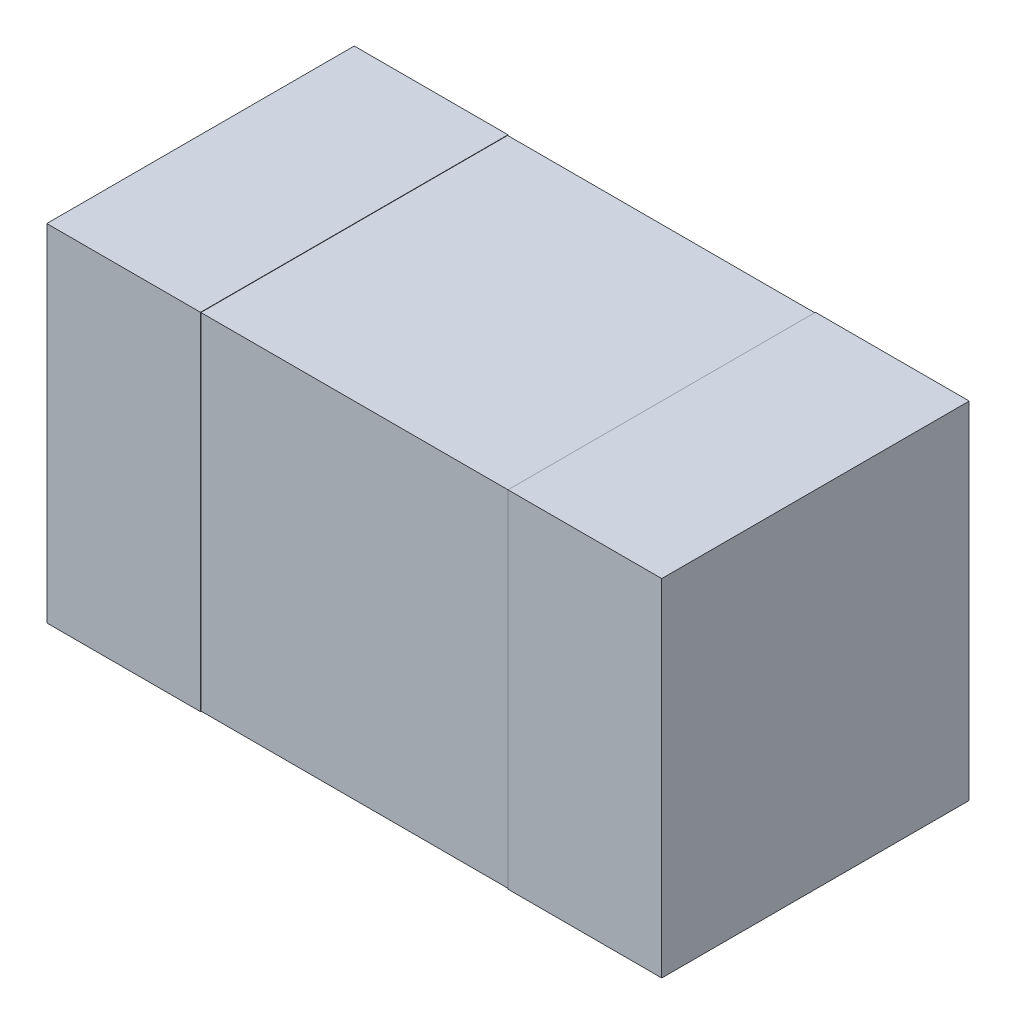
ISO-10303-21;
HEADER;
FILE_DESCRIPTION(('STEP AP214'),'2;1');
FILE_NAME('part.step','',(''),(''),'','','');
FILE_SCHEMA(('AUTOMOTIVE_DESIGN { 1 0 10303 214 1 1 1 1 }'));
ENDSEC;
DATA;
#1=APPLICATION_CONTEXT('core data for automotive mechanical design processes');
#2=APPLICATION_PROTOCOL_DEFINITION('international standard','automotive_design',2000,#1);
#3=PRODUCT_CONTEXT('',#1,'mechanical');
#4=PRODUCT('Part','Part','',(#3));
#5=PRODUCT_RELATED_PRODUCT_CATEGORY('part','',(#4));
#6=PRODUCT_DEFINITION_FORMATION('','',#4);
#7=PRODUCT_DEFINITION_CONTEXT('part definition',#1,'design');
#8=PRODUCT_DEFINITION('design','',#6,#7);
#9=PRODUCT_DEFINITION_SHAPE('','',#8);
#10=(LENGTH_UNIT() NAMED_UNIT(*) SI_UNIT(.MILLI.,.METRE.));
#11=(NAMED_UNIT(*) PLANE_ANGLE_UNIT() SI_UNIT($,.RADIAN.));
#12=(NAMED_UNIT(*) SI_UNIT($,.STERADIAN.) SOLID_ANGLE_UNIT());
#13=UNCERTAINTY_MEASURE_WITH_UNIT(LENGTH_MEASURE(1.E-05),#10,'distance_accuracy_value','');
#14=(GEOMETRIC_REPRESENTATION_CONTEXT(3) GLOBAL_UNCERTAINTY_ASSIGNED_CONTEXT((#13)) GLOBAL_UNIT_ASSIGNED_CONTEXT((#10,
#11,#12)) REPRESENTATION_CONTEXT('',''));
#15=CARTESIAN_POINT('',(0.,0.,0.));
#16=DIRECTION('',(0.,0.,1.));
#17=DIRECTION('',(1.,0.,0.));
#18=AXIS2_PLACEMENT_3D('',#15,#16,#17);
#19=CARTESIAN_POINT('',(-0.8,0.45,0.8));
#20=DIRECTION('',(1.,0.,0.));
#21=DIRECTION('',(0.,0.,-1.));
#22=AXIS2_PLACEMENT_3D('',#19,#20,#21);
#23=PLANE('',#22);
#24=DIRECTION('',(0.,1.,0.));
#25=VECTOR('',#24,1.);
#26=CARTESIAN_POINT('',(-0.8,0.45,0.));
#27=LINE('',#26,#25);
#28=CARTESIAN_POINT('',(-0.8,0.45,0.));
#29=VERTEX_POINT('',#28);
#30=CARTESIAN_POINT('',(-0.8,-0.45,0.));
#31=VERTEX_POINT('',#30);
#32=EDGE_CURVE('E122',#29,#31,#27,.F.);
#33=ORIENTED_EDGE('',*,*,#32,.T.);
#34=DIRECTION('',(0.,0.,1.));
#35=VECTOR('',#34,1.);
#36=CARTESIAN_POINT('',(-0.8,-0.45,0.4));
#37=LINE('',#36,#35);
#38=CARTESIAN_POINT('',(-0.8,-0.45,0.8));
#39=VERTEX_POINT('',#38);
#40=EDGE_CURVE('E114',#31,#39,#37,.T.);
#41=ORIENTED_EDGE('',*,*,#40,.T.);
#42=DIRECTION('',(0.,1.,0.));
#43=VECTOR('',#42,1.);
#44=CARTESIAN_POINT('',(-0.8,0.45,0.8));
#45=LINE('',#44,#43);
#46=CARTESIAN_POINT('',(-0.8,0.45,0.8));
#47=VERTEX_POINT('',#46);
#48=EDGE_CURVE('E20',#39,#47,#45,.T.);
#49=ORIENTED_EDGE('',*,*,#48,.T.);
#50=DIRECTION('',(0.,0.,1.));
#51=VECTOR('',#50,1.);
#52=CARTESIAN_POINT('',(-0.8,0.45,0.4));
#53=LINE('',#52,#51);
#54=EDGE_CURVE('E102',#29,#47,#53,.T.);
#55=ORIENTED_EDGE('',*,*,#54,.F.);
#56=EDGE_LOOP('',(#33,#41,#49,#55));
#57=FACE_BOUND('',#56,.T.);
#58=ADVANCED_FACE('F17',(#57),#23,.F.);
#59=CARTESIAN_POINT('',(0.8,0.45,0.8));
#60=DIRECTION('',(0.,0.,-1.));
#61=DIRECTION('',(-1.,0.,0.));
#62=AXIS2_PLACEMENT_3D('',#59,#60,#61);
#63=PLANE('',#62);
#64=ORIENTED_EDGE('',*,*,#48,.F.);
#65=DIRECTION('',(1.,0.,0.));
#66=VECTOR('',#65,1.);
#67=CARTESIAN_POINT('',(0.,-0.45,0.8));
#68=LINE('',#67,#66);
#69=CARTESIAN_POINT('',(-0.4,-0.45,0.8));
#70=VERTEX_POINT('',#69);
#71=EDGE_CURVE('E130',#39,#70,#68,.T.);
#72=ORIENTED_EDGE('',*,*,#71,.T.);
#73=DIRECTION('',(0.,1.,0.));
#74=VECTOR('',#73,1.);
#75=CARTESIAN_POINT('',(-0.4,0.45,0.8));
#76=LINE('',#75,#74);
#77=CARTESIAN_POINT('',(-0.4,0.45,0.8));
#78=VERTEX_POINT('',#77);
#79=EDGE_CURVE('E120',#70,#78,#76,.T.);
#80=ORIENTED_EDGE('',*,*,#79,.T.);
#81=DIRECTION('',(1.,0.,0.));
#82=VECTOR('',#81,1.);
#83=CARTESIAN_POINT('',(0.,0.45,0.8));
#84=LINE('',#83,#82);
#85=EDGE_CURVE('E109',#47,#78,#84,.T.);
#86=ORIENTED_EDGE('',*,*,#85,.F.);
#87=EDGE_LOOP('',(#64,#72,#80,#86));
#88=FACE_BOUND('',#87,.T.);
#89=ADVANCED_FACE('F119',(#88),#63,.F.);
#90=CARTESIAN_POINT('',(0.,0.45,0.4));
#91=DIRECTION('',(0.,1.,0.));
#92=DIRECTION('',(0.,0.,1.));
#93=AXIS2_PLACEMENT_3D('',#90,#91,#92);
#94=PLANE('',#93);
#95=ORIENTED_EDGE('',*,*,#54,.T.);
#96=ORIENTED_EDGE('',*,*,#85,.T.);
#97=DIRECTION('',(0.,0.,1.));
#98=VECTOR('',#97,1.);
#99=CARTESIAN_POINT('',(-0.4,0.45,0.8));
#100=LINE('',#99,#98);
#101=CARTESIAN_POINT('',(-0.400000000000019,0.45,0.));
#102=VERTEX_POINT('',#101);
#103=EDGE_CURVE('E133',#78,#102,#100,.F.);
#104=ORIENTED_EDGE('',*,*,#103,.T.);
#105=DIRECTION('',(1.,0.,0.));
#106=VECTOR('',#105,1.);
#107=CARTESIAN_POINT('',(0.8,0.45,0.));
#108=LINE('',#107,#106);
#109=EDGE_CURVE('E111',#102,#29,#108,.F.);
#110=ORIENTED_EDGE('',*,*,#109,.T.);
#111=EDGE_LOOP('',(#95,#96,#104,#110));
#112=FACE_BOUND('',#111,.T.);
#113=ADVANCED_FACE('F106',(#112),#94,.T.);
#114=CARTESIAN_POINT('',(0.8,0.45,0.));
#115=DIRECTION('',(0.,0.,1.));
#116=DIRECTION('',(1.,0.,0.));
#117=AXIS2_PLACEMENT_3D('',#114,#115,#116);
#118=PLANE('',#117);
#119=ORIENTED_EDGE('',*,*,#32,.F.);
#120=ORIENTED_EDGE('',*,*,#109,.F.);
#121=DIRECTION('',(0.,1.,0.));
#122=VECTOR('',#121,1.);
#123=CARTESIAN_POINT('',(-0.400000000000043,0.45,0.));
#124=LINE('',#123,#122);
#125=CARTESIAN_POINT('',(-0.400000000000027,-0.45,0.));
#126=VERTEX_POINT('',#125);
#127=EDGE_CURVE('E135',#102,#126,#124,.F.);
#128=ORIENTED_EDGE('',*,*,#127,.T.);
#129=DIRECTION('',(1.,0.,0.));
#130=VECTOR('',#129,1.);
#131=CARTESIAN_POINT('',(0.,-0.45,0.));
#132=LINE('',#131,#130);
#133=EDGE_CURVE('E126',#126,#31,#132,.F.);
#134=ORIENTED_EDGE('',*,*,#133,.T.);
#135=EDGE_LOOP('',(#119,#120,#128,#134));
#136=FACE_BOUND('',#135,.T.);
#137=ADVANCED_FACE('F255',(#136),#118,.F.);
#138=CARTESIAN_POINT('',(0.,-0.45,0.4));
#139=DIRECTION('',(0.,1.,0.));
#140=DIRECTION('',(0.,0.,1.));
#141=AXIS2_PLACEMENT_3D('',#138,#139,#140);
#142=PLANE('',#141);
#143=ORIENTED_EDGE('',*,*,#40,.F.);
#144=ORIENTED_EDGE('',*,*,#133,.F.);
#145=DIRECTION('',(0.,0.,1.));
#146=VECTOR('',#145,1.);
#147=CARTESIAN_POINT('',(-0.4,-0.45,0.8));
#148=LINE('',#147,#146);
#149=EDGE_CURVE('E138',#126,#70,#148,.T.);
#150=ORIENTED_EDGE('',*,*,#149,.T.);
#151=ORIENTED_EDGE('',*,*,#71,.F.);
#152=EDGE_LOOP('',(#143,#144,#150,#151));
#153=FACE_BOUND('',#152,.T.);
#154=ADVANCED_FACE('F251',(#153),#142,.F.);
#155=CARTESIAN_POINT('',(-0.4,0.45,0.8));
#156=DIRECTION('',(-1.,0.,0.));
#157=DIRECTION('',(0.,0.,1.));
#158=AXIS2_PLACEMENT_3D('',#155,#156,#157);
#159=PLANE('',#158);
#160=DIRECTION('',(0.,0.,1.));
#161=VECTOR('',#160,1.);
#162=CARTESIAN_POINT('',(-0.4,0.449,0.));
#163=LINE('',#162,#161);
#164=CARTESIAN_POINT('',(-0.4,0.449,0.799));
#165=VERTEX_POINT('',#164);
#166=CARTESIAN_POINT('',(-0.400000000000015,0.449,0.00100000000000003));
#167=VERTEX_POINT('',#166);
#168=EDGE_CURVE('E146',#165,#167,#163,.F.);
#169=ORIENTED_EDGE('',*,*,#168,.T.);
#170=DIRECTION('',(0.,1.,0.));
#171=VECTOR('',#170,1.);
#172=CARTESIAN_POINT('',(-0.400000000000015,0.45,0.00100000000000003));
#173=LINE('',#172,#171);
#174=CARTESIAN_POINT('',(-0.400000000000025,-0.449,0.00100000000000003));
#175=VERTEX_POINT('',#174);
#176=EDGE_CURVE('E151',#167,#175,#173,.F.);
#177=ORIENTED_EDGE('',*,*,#176,.T.);
#178=DIRECTION('',(0.,0.,-1.));
#179=VECTOR('',#178,1.);
#180=CARTESIAN_POINT('',(-0.4,-0.449,0.));
#181=LINE('',#180,#179);
#182=CARTESIAN_POINT('',(-0.4,-0.449,0.799));
#183=VERTEX_POINT('',#182);
#184=EDGE_CURVE('E154',#183,#175,#181,.T.);
#185=ORIENTED_EDGE('',*,*,#184,.F.);
#186=DIRECTION('',(0.,1.,0.));
#187=VECTOR('',#186,1.);
#188=CARTESIAN_POINT('',(-0.4,0.45,0.799));
#189=LINE('',#188,#187);
#190=EDGE_CURVE('E141',#183,#165,#189,.T.);
#191=ORIENTED_EDGE('',*,*,#190,.T.);
#192=EDGE_LOOP('',(#169,#177,#185,#191));
#193=FACE_BOUND('',#192,.T.);
#194=ORIENTED_EDGE('',*,*,#127,.F.);
#195=ORIENTED_EDGE('',*,*,#103,.F.);
#196=ORIENTED_EDGE('',*,*,#79,.F.);
#197=ORIENTED_EDGE('',*,*,#149,.F.);
#198=EDGE_LOOP('',(#194,#195,#196,#197));
#199=FACE_BOUND('',#198,.T.);
#200=ADVANCED_FACE('F247',(#193,#199),#159,.F.);
#201=CARTESIAN_POINT('',(-0.4,0.45,0.799));
#202=DIRECTION('',(0.,0.,-1.));
#203=DIRECTION('',(-1.,0.,0.));
#204=AXIS2_PLACEMENT_3D('',#201,#202,#203);
#205=PLANE('',#204);
#206=DIRECTION('',(1.,0.,0.));
#207=VECTOR('',#206,1.);
#208=CARTESIAN_POINT('',(-0.4,0.449,0.799));
#209=LINE('',#208,#207);
#210=CARTESIAN_POINT('',(0.4,0.449,0.799));
#211=VERTEX_POINT('',#210);
#212=EDGE_CURVE('E143',#211,#165,#209,.F.);
#213=ORIENTED_EDGE('',*,*,#212,.T.);
#214=ORIENTED_EDGE('',*,*,#190,.F.);
#215=DIRECTION('',(1.,0.,0.));
#216=VECTOR('',#215,1.);
#217=CARTESIAN_POINT('',(0.,-0.449,0.799));
#218=LINE('',#217,#216);
#219=CARTESIAN_POINT('',(0.4,-0.449,0.799));
#220=VERTEX_POINT('',#219);
#221=EDGE_CURVE('E158',#220,#183,#218,.F.);
#222=ORIENTED_EDGE('',*,*,#221,.F.);
#223=DIRECTION('',(0.,1.,0.));
#224=VECTOR('',#223,1.);
#225=CARTESIAN_POINT('',(0.4,0.45,0.799));
#226=LINE('',#225,#224);
#227=EDGE_CURVE('E161',#220,#211,#226,.T.);
#228=ORIENTED_EDGE('',*,*,#227,.T.);
#229=EDGE_LOOP('',(#213,#214,#222,#228));
#230=FACE_BOUND('',#229,.T.);
#231=ADVANCED_FACE('F243',(#230),#205,.F.);
#232=CARTESIAN_POINT('',(-0.4,0.449,0.));
#233=DIRECTION('',(0.,-1.,0.));
#234=DIRECTION('',(1.,0.,0.));
#235=AXIS2_PLACEMENT_3D('',#232,#233,#234);
#236=PLANE('',#235);
#237=DIRECTION('',(1.,0.,0.));
#238=VECTOR('',#237,1.);
#239=CARTESIAN_POINT('',(-0.4,0.449,0.00100000000000003));
#240=LINE('',#239,#238);
#241=CARTESIAN_POINT('',(0.4,0.449,0.00100000000000003));
#242=VERTEX_POINT('',#241);
#243=EDGE_CURVE('E148',#242,#167,#240,.F.);
#244=ORIENTED_EDGE('',*,*,#243,.T.);
#245=ORIENTED_EDGE('',*,*,#168,.F.);
#246=ORIENTED_EDGE('',*,*,#212,.F.);
#247=DIRECTION('',(0.,0.,-1.));
#248=VECTOR('',#247,1.);
#249=CARTESIAN_POINT('',(0.4,0.449,0.8));
#250=LINE('',#249,#248);
#251=EDGE_CURVE('E164',#211,#242,#250,.T.);
#252=ORIENTED_EDGE('',*,*,#251,.T.);
#253=EDGE_LOOP('',(#244,#245,#246,#252));
#254=FACE_BOUND('',#253,.T.);
#255=ADVANCED_FACE('F239',(#254),#236,.F.);
#256=CARTESIAN_POINT('',(-0.4,0.45,0.00100000000000003));
#257=DIRECTION('',(0.,0.,1.));
#258=DIRECTION('',(1.,0.,0.));
#259=AXIS2_PLACEMENT_3D('',#256,#257,#258);
#260=PLANE('',#259);
#261=ORIENTED_EDGE('',*,*,#243,.F.);
#262=DIRECTION('',(0.,1.,0.));
#263=VECTOR('',#262,1.);
#264=CARTESIAN_POINT('',(0.4,0.45,0.00100000000000002));
#265=LINE('',#264,#263);
#266=CARTESIAN_POINT('',(0.4,-0.449,0.00100000000000003));
#267=VERTEX_POINT('',#266);
#268=EDGE_CURVE('E167',#242,#267,#265,.F.);
#269=ORIENTED_EDGE('',*,*,#268,.T.);
#270=DIRECTION('',(1.,0.,0.));
#271=VECTOR('',#270,1.);
#272=CARTESIAN_POINT('',(0.,-0.449,0.00100000000000003));
#273=LINE('',#272,#271);
#274=EDGE_CURVE('E156',#175,#267,#273,.T.);
#275=ORIENTED_EDGE('',*,*,#274,.F.);
#276=ORIENTED_EDGE('',*,*,#176,.F.);
#277=EDGE_LOOP('',(#261,#269,#275,#276));
#278=FACE_BOUND('',#277,.T.);
#279=ADVANCED_FACE('F235',(#278),#260,.F.);
#280=CARTESIAN_POINT('',(0.,-0.449,0.));
#281=DIRECTION('',(0.,-1.,0.));
#282=DIRECTION('',(0.,0.,-1.));
#283=AXIS2_PLACEMENT_3D('',#280,#281,#282);
#284=PLANE('',#283);
#285=DIRECTION('',(0.,0.,-1.));
#286=VECTOR('',#285,1.);
#287=CARTESIAN_POINT('',(0.4,-0.449,0.8));
#288=LINE('',#287,#286);
#289=EDGE_CURVE('E170',#267,#220,#288,.F.);
#290=ORIENTED_EDGE('',*,*,#289,.T.);
#291=ORIENTED_EDGE('',*,*,#221,.T.);
#292=ORIENTED_EDGE('',*,*,#184,.T.);
#293=ORIENTED_EDGE('',*,*,#274,.T.);
#294=EDGE_LOOP('',(#290,#291,#292,#293));
#295=FACE_BOUND('',#294,.T.);
#296=ADVANCED_FACE('F231',(#295),#284,.T.);
#297=CARTESIAN_POINT('',(0.4,0.45,0.8));
#298=DIRECTION('',(1.,0.,0.));
#299=DIRECTION('',(0.,0.,-1.));
#300=AXIS2_PLACEMENT_3D('',#297,#298,#299);
#301=PLANE('',#300);
#302=ORIENTED_EDGE('',*,*,#268,.F.);
#303=ORIENTED_EDGE('',*,*,#251,.F.);
#304=ORIENTED_EDGE('',*,*,#227,.F.);
#305=ORIENTED_EDGE('',*,*,#289,.F.);
#306=EDGE_LOOP('',(#302,#303,#304,#305));
#307=FACE_BOUND('',#306,.T.);
#308=DIRECTION('',(0.,1.,0.));
#309=VECTOR('',#308,1.);
#310=CARTESIAN_POINT('',(0.4,0.45,0.));
#311=LINE('',#310,#309);
#312=CARTESIAN_POINT('',(0.4,0.45,0.));
#313=VERTEX_POINT('',#312);
#314=CARTESIAN_POINT('',(0.4,-0.45,0.));
#315=VERTEX_POINT('',#314);
#316=EDGE_CURVE('E173',#313,#315,#311,.F.);
#317=ORIENTED_EDGE('',*,*,#316,.T.);
#318=DIRECTION('',(0.,0.,1.));
#319=VECTOR('',#318,1.);
#320=CARTESIAN_POINT('',(0.4,-0.45,0.4));
#321=LINE('',#320,#319);
#322=CARTESIAN_POINT('',(0.4,-0.45,0.8));
#323=VERTEX_POINT('',#322);
#324=EDGE_CURVE('E176',#315,#323,#321,.T.);
#325=ORIENTED_EDGE('',*,*,#324,.T.);
#326=DIRECTION('',(0.,1.,0.));
#327=VECTOR('',#326,1.);
#328=CARTESIAN_POINT('',(0.4,0.45,0.8));
#329=LINE('',#328,#327);
#330=CARTESIAN_POINT('',(0.4,0.45,0.8));
#331=VERTEX_POINT('',#330);
#332=EDGE_CURVE('E182',#323,#331,#329,.T.);
#333=ORIENTED_EDGE('',*,*,#332,.T.);
#334=DIRECTION('',(0.,0.,1.));
#335=VECTOR('',#334,1.);
#336=CARTESIAN_POINT('',(0.4,0.45,0.4));
#337=LINE('',#336,#335);
#338=EDGE_CURVE('E191',#313,#331,#337,.T.);
#339=ORIENTED_EDGE('',*,*,#338,.F.);
#340=EDGE_LOOP('',(#317,#325,#333,#339));
#341=FACE_BOUND('',#340,.T.);
#342=ADVANCED_FACE('F228',(#307,#341),#301,.F.);
#343=CARTESIAN_POINT('',(0.8,0.45,0.));
#344=DIRECTION('',(0.,0.,1.));
#345=DIRECTION('',(1.,0.,0.));
#346=AXIS2_PLACEMENT_3D('',#343,#344,#345);
#347=PLANE('',#346);
#348=DIRECTION('',(0.,1.,0.));
#349=VECTOR('',#348,1.);
#350=CARTESIAN_POINT('',(0.8,0.45,0.));
#351=LINE('',#350,#349);
#352=CARTESIAN_POINT('',(0.8,0.45,0.));
#353=VERTEX_POINT('',#352);
#354=CARTESIAN_POINT('',(0.8,-0.45,0.));
#355=VERTEX_POINT('',#354);
#356=EDGE_CURVE('E194',#353,#355,#351,.F.);
#357=ORIENTED_EDGE('',*,*,#356,.T.);
#358=DIRECTION('',(1.,0.,0.));
#359=VECTOR('',#358,1.);
#360=CARTESIAN_POINT('',(0.,-0.45,0.));
#361=LINE('',#360,#359);
#362=EDGE_CURVE('E179',#355,#315,#361,.F.);
#363=ORIENTED_EDGE('',*,*,#362,.T.);
#364=ORIENTED_EDGE('',*,*,#316,.F.);
#365=DIRECTION('',(1.,0.,0.));
#366=VECTOR('',#365,1.);
#367=CARTESIAN_POINT('',(0.,0.45,0.));
#368=LINE('',#367,#366);
#369=EDGE_CURVE('E188',#353,#313,#368,.F.);
#370=ORIENTED_EDGE('',*,*,#369,.F.);
#371=EDGE_LOOP('',(#357,#363,#364,#370));
#372=FACE_BOUND('',#371,.T.);
#373=ADVANCED_FACE('F210',(#372),#347,.F.);
#374=CARTESIAN_POINT('',(0.,-0.45,0.4));
#375=DIRECTION('',(0.,1.,0.));
#376=DIRECTION('',(0.,0.,1.));
#377=AXIS2_PLACEMENT_3D('',#374,#375,#376);
#378=PLANE('',#377);
#379=DIRECTION('',(0.,0.,1.));
#380=VECTOR('',#379,1.);
#381=CARTESIAN_POINT('',(0.8,-0.45,0.8));
#382=LINE('',#381,#380);
#383=CARTESIAN_POINT('',(0.8,-0.45,0.8));
#384=VERTEX_POINT('',#383);
#385=EDGE_CURVE('E197',#355,#384,#382,.T.);
#386=ORIENTED_EDGE('',*,*,#385,.T.);
#387=DIRECTION('',(-1.,0.,0.));
#388=VECTOR('',#387,1.);
#389=CARTESIAN_POINT('',(0.8,-0.45,0.8));
#390=LINE('',#389,#388);
#391=EDGE_CURVE('E185',#384,#323,#390,.T.);
#392=ORIENTED_EDGE('',*,*,#391,.T.);
#393=ORIENTED_EDGE('',*,*,#324,.F.);
#394=ORIENTED_EDGE('',*,*,#362,.F.);
#395=EDGE_LOOP('',(#386,#392,#393,#394));
#396=FACE_BOUND('',#395,.T.);
#397=ADVANCED_FACE('F208',(#396),#378,.F.);
#398=CARTESIAN_POINT('',(0.8,0.45,0.8));
#399=DIRECTION('',(0.,0.,-1.));
#400=DIRECTION('',(-1.,0.,0.));
#401=AXIS2_PLACEMENT_3D('',#398,#399,#400);
#402=PLANE('',#401);
#403=DIRECTION('',(0.,1.,0.));
#404=VECTOR('',#403,1.);
#405=CARTESIAN_POINT('',(0.8,0.45,0.8));
#406=LINE('',#405,#404);
#407=CARTESIAN_POINT('',(0.8,0.45,0.8));
#408=VERTEX_POINT('',#407);
#409=EDGE_CURVE('E26',#384,#408,#406,.T.);
#410=ORIENTED_EDGE('',*,*,#409,.T.);
#411=DIRECTION('',(1.,0.,0.));
#412=VECTOR('',#411,1.);
#413=CARTESIAN_POINT('',(0.,0.45,0.8));
#414=LINE('',#413,#412);
#415=EDGE_CURVE('E34',#331,#408,#414,.T.);
#416=ORIENTED_EDGE('',*,*,#415,.F.);
#417=ORIENTED_EDGE('',*,*,#332,.F.);
#418=ORIENTED_EDGE('',*,*,#391,.F.);
#419=EDGE_LOOP('',(#410,#416,#417,#418));
#420=FACE_BOUND('',#419,.T.);
#421=ADVANCED_FACE('F203',(#420),#402,.F.);
#422=CARTESIAN_POINT('',(0.,0.45,0.4));
#423=DIRECTION('',(0.,1.,0.));
#424=DIRECTION('',(0.,0.,1.));
#425=AXIS2_PLACEMENT_3D('',#422,#423,#424);
#426=PLANE('',#425);
#427=ORIENTED_EDGE('',*,*,#415,.T.);
#428=DIRECTION('',(0.,0.,1.));
#429=VECTOR('',#428,1.);
#430=CARTESIAN_POINT('',(0.8,0.45,0.8));
#431=LINE('',#430,#429);
#432=EDGE_CURVE('E11',#408,#353,#431,.F.);
#433=ORIENTED_EDGE('',*,*,#432,.T.);
#434=ORIENTED_EDGE('',*,*,#369,.T.);
#435=ORIENTED_EDGE('',*,*,#338,.T.);
#436=EDGE_LOOP('',(#427,#433,#434,#435));
#437=FACE_BOUND('',#436,.T.);
#438=ADVANCED_FACE('F213',(#437),#426,.T.);
#439=CARTESIAN_POINT('',(0.8,0.45,0.8));
#440=DIRECTION('',(-1.,0.,0.));
#441=DIRECTION('',(0.,0.,1.));
#442=AXIS2_PLACEMENT_3D('',#439,#440,#441);
#443=PLANE('',#442);
#444=ORIENTED_EDGE('',*,*,#409,.F.);
#445=ORIENTED_EDGE('',*,*,#385,.F.);
#446=ORIENTED_EDGE('',*,*,#356,.F.);
#447=ORIENTED_EDGE('',*,*,#432,.F.);
#448=EDGE_LOOP('',(#444,#445,#446,#447));
#449=FACE_BOUND('',#448,.T.);
#450=ADVANCED_FACE('F206',(#449),#443,.F.);
#451=CLOSED_SHELL('',(#58,#89,#113,#137,#154,#200,#231,#255,#279,#296,#342,#373,#397,#421,#438,#450));
#452=MANIFOLD_SOLID_BREP('B1',#451);
#453=ADVANCED_BREP_SHAPE_REPRESENTATION('',(#18,#452),#14);
#454=SHAPE_DEFINITION_REPRESENTATION(#9,#453);
ENDSEC;
END-ISO-10303-21;
